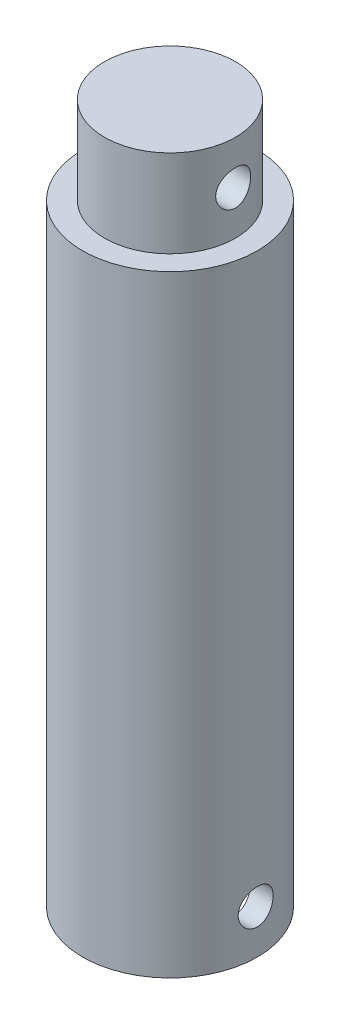
ISO-10303-21;
HEADER;
FILE_DESCRIPTION(('STEP AP214'),'2;1');
FILE_NAME('part.step','',(''),(''),'','','');
FILE_SCHEMA(('AUTOMOTIVE_DESIGN { 1 0 10303 214 1 1 1 1 }'));
ENDSEC;
DATA;
#1=APPLICATION_CONTEXT('core data for automotive mechanical design processes');
#2=APPLICATION_PROTOCOL_DEFINITION('international standard','automotive_design',2000,#1);
#3=PRODUCT_CONTEXT('',#1,'mechanical');
#4=PRODUCT('Part','Part','',(#3));
#5=PRODUCT_RELATED_PRODUCT_CATEGORY('part','',(#4));
#6=PRODUCT_DEFINITION_FORMATION('','',#4);
#7=PRODUCT_DEFINITION_CONTEXT('part definition',#1,'design');
#8=PRODUCT_DEFINITION('design','',#6,#7);
#9=PRODUCT_DEFINITION_SHAPE('','',#8);
#10=(LENGTH_UNIT() NAMED_UNIT(*) SI_UNIT(.MILLI.,.METRE.));
#11=(NAMED_UNIT(*) PLANE_ANGLE_UNIT() SI_UNIT($,.RADIAN.));
#12=(NAMED_UNIT(*) SI_UNIT($,.STERADIAN.) SOLID_ANGLE_UNIT());
#13=UNCERTAINTY_MEASURE_WITH_UNIT(LENGTH_MEASURE(1.E-05),#10,'distance_accuracy_value','');
#14=(GEOMETRIC_REPRESENTATION_CONTEXT(3) GLOBAL_UNCERTAINTY_ASSIGNED_CONTEXT((#13)) GLOBAL_UNIT_ASSIGNED_CONTEXT((#10,
#11,#12)) REPRESENTATION_CONTEXT('',''));
#15=CARTESIAN_POINT('',(0.,0.,0.));
#16=DIRECTION('',(0.,0.,1.));
#17=DIRECTION('',(1.,0.,0.));
#18=AXIS2_PLACEMENT_3D('',#15,#16,#17);
#19=CARTESIAN_POINT('',(-1.56472057533108E-13,54.9999999999999,0.));
#20=DIRECTION('',(0.,-1.,0.));
#21=DIRECTION('',(1.,0.,0.));
#22=AXIS2_PLACEMENT_3D('',#19,#20,#21);
#23=CYLINDRICAL_SURFACE('',#22,10.);
#24=CARTESIAN_POINT('',(-1.28022592527089E-13,45.,0.));
#25=DIRECTION('',(0.,1.,0.));
#26=DIRECTION('',(-1.,0.,0.));
#27=AXIS2_PLACEMENT_3D('',#24,#25,#26);
#28=CIRCLE('',#27,10.);
#29=CARTESIAN_POINT('',(-10.0000000000001,44.9999999999999,0.));
#30=VERTEX_POINT('',#29);
#31=EDGE_CURVE('E10',#30,#30,#28,.T.);
#32=ORIENTED_EDGE('',*,*,#31,.F.);
#33=EDGE_LOOP('',(#32));
#34=FACE_BOUND('',#33,.T.);
#35=CARTESIAN_POINT('',(0.,-25.0000000000001,0.));
#36=DIRECTION('',(0.,1.,0.));
#37=DIRECTION('',(-1.,0.,0.));
#38=AXIS2_PLACEMENT_3D('',#35,#36,#37);
#39=CIRCLE('',#38,10.);
#40=CARTESIAN_POINT('',(-9.99999999999993,-25.0000000000002,0.));
#41=VERTEX_POINT('',#40);
#42=EDGE_CURVE('E77',#41,#41,#39,.T.);
#43=ORIENTED_EDGE('',*,*,#42,.T.);
#44=EDGE_LOOP('',(#43));
#45=FACE_BOUND('',#44,.T.);
#46=CARTESIAN_POINT('',(-9.79795897113266,-20.0000000000001,2.));
#47=CARTESIAN_POINT('',(-9.79796118053287,-19.8888712490178,1.99999589175054));
#48=CARTESIAN_POINT('',(-9.79987016537398,-19.7776907533334,1.99070634343629));
#49=CARTESIAN_POINT('',(-9.80728862609744,-19.5584749897138,1.95382456716568));
#50=CARTESIAN_POINT('',(-9.81280098289569,-19.4504423107281,1.92621769414099));
#51=CARTESIAN_POINT('',(-9.82677747443703,-19.2407253932917,1.85359156523949));
#52=CARTESIAN_POINT('',(-9.83523867242145,-19.1390349569349,1.80858962830524));
#53=CARTESIAN_POINT('',(-9.85415598961312,-18.9446503106062,1.70249821534101));
#54=CARTESIAN_POINT('',(-9.86461199746917,-18.8519555989243,1.6414096372023));
#55=CARTESIAN_POINT('',(-9.886505993885,-18.6768779922924,1.50395815130687));
#56=CARTESIAN_POINT('',(-9.89795475674488,-18.5946408242321,1.42741131182664));
#57=CARTESIAN_POINT('',(-9.92044944605192,-18.4440849328421,1.26161357804262));
#58=CARTESIAN_POINT('',(-9.93149534421658,-18.3757671851657,1.17236179395597));
#59=CARTESIAN_POINT('',(-9.95205592835119,-18.2544239647432,0.982722711848509));
#60=CARTESIAN_POINT('',(-9.96155642883096,-18.2015369723668,0.882245135344419));
#61=CARTESIAN_POINT('',(-9.97783473767258,-18.1134501259038,0.67360830077454));
#62=CARTESIAN_POINT('',(-9.98461280088233,-18.0782486161981,0.565449762841103));
#63=CARTESIAN_POINT('',(-9.99460641376832,-18.0269856127608,0.346033546556986));
#64=CARTESIAN_POINT('',(-9.99786772576249,-18.0106780448581,0.234835478429626));
#65=CARTESIAN_POINT('',(-10.000618423672,-17.9968980963234,0.0112371368750714));
#66=CARTESIAN_POINT('',(-10.0001081730551,-17.9994239007084,-0.101163019663687));
#67=CARTESIAN_POINT('',(-9.99540869737026,-18.0230523604312,-0.322284001487177));
#68=CARTESIAN_POINT('',(-9.99127196731671,-18.0438899543358,-0.43103442859694));
#69=CARTESIAN_POINT('',(-9.97984354318812,-18.1031300649179,-0.643463253160602));
#70=CARTESIAN_POINT('',(-9.97255172288073,-18.1415332843838,-0.747141447494258));
#71=CARTESIAN_POINT('',(-9.95554592039912,-18.2350600802946,-0.947238926401775));
#72=CARTESIAN_POINT('',(-9.94581696350442,-18.2902875022099,-1.0436083482678));
#73=CARTESIAN_POINT('',(-9.92500938947565,-18.4158181544733,-1.22581009171951));
#74=CARTESIAN_POINT('',(-9.91393061710439,-18.4861231195411,-1.31164119905));
#75=CARTESIAN_POINT('',(-9.89141928728914,-18.641267244217,-1.47190286210691));
#76=CARTESIAN_POINT('',(-9.87998392915027,-18.7263383734593,-1.54610863314726));
#77=CARTESIAN_POINT('',(-9.85823143197516,-18.9078328849016,-1.67923698635361));
#78=CARTESIAN_POINT('',(-9.84791431409091,-19.0042564817665,-1.7381592794555));
#79=CARTESIAN_POINT('',(-9.82956094945842,-19.2060416636437,-1.83912562960376));
#80=CARTESIAN_POINT('',(-9.82152963127093,-19.3114219352794,-1.88113329555542));
#81=CARTESIAN_POINT('',(-9.8087295264254,-19.5279426474481,-1.94678068325516));
#82=CARTESIAN_POINT('',(-9.8039603145685,-19.6390823352382,-1.97042279891329));
#83=CARTESIAN_POINT('',(-9.7983095853565,-19.8619297159982,-1.9983320120721));
#84=CARTESIAN_POINT('',(-9.79736294114303,-19.9735951486208,-2.00292371779582));
#85=CARTESIAN_POINT('',(-9.79928971377702,-20.1960964463994,-1.99347525662148));
#86=CARTESIAN_POINT('',(-9.8021629140077,-20.3069323582378,-1.97943614624489));
#87=CARTESIAN_POINT('',(-9.81134464989823,-20.5235372805845,-1.93340441614831));
#88=CARTESIAN_POINT('',(-9.81761998028987,-20.6293446860716,-1.9015852416786));
#89=CARTESIAN_POINT('',(-9.83286978703324,-20.8341265580576,-1.82108207061704));
#90=CARTESIAN_POINT('',(-9.84184448572533,-20.9331004608715,-1.77239668474636));
#91=CARTESIAN_POINT('',(-9.86162811924073,-21.1228262199004,-1.6588082844312));
#92=CARTESIAN_POINT('',(-9.872459437298,-21.2134540926017,-1.59370215596551));
#93=CARTESIAN_POINT('',(-9.89467447653267,-21.3826166240019,-1.44939114442543));
#94=CARTESIAN_POINT('',(-9.9060582544763,-21.4611500364986,-1.37018481028908));
#95=CARTESIAN_POINT('',(-9.92830691738425,-21.6051251183712,-1.19846454699578));
#96=CARTESIAN_POINT('',(-9.93916115417361,-21.6703473093001,-1.10576499785926));
#97=CARTESIAN_POINT('',(-9.95894255257233,-21.7842917629992,-0.91053579326951));
#98=CARTESIAN_POINT('',(-9.96786979510416,-21.8330147186896,-0.808006550867013));
#99=CARTESIAN_POINT('',(-9.98274588122126,-21.9122577434934,-0.596605361648026));
#100=CARTESIAN_POINT('',(-9.98871158285199,-21.9428810364526,-0.487773346956157));
#101=CARTESIAN_POINT('',(-9.99706471875317,-21.9853824953278,-0.266378909359824));
#102=CARTESIAN_POINT('',(-9.99945258399692,-21.9972629189514,-0.153816937422424));
#103=CARTESIAN_POINT('',(-10.0003708090822,-22.0018539619259,0.0697457878072416));
#104=CARTESIAN_POINT('',(-9.99896757098653,-21.9948945609125,0.180739624282988));
#105=CARTESIAN_POINT('',(-9.99260087120672,-21.9627320989044,0.3999420626313));
#106=CARTESIAN_POINT('',(-9.98763745428856,-21.9375292673038,0.508150699507445));
#107=CARTESIAN_POINT('',(-9.97470996729835,-21.8697420158169,0.718505499490129));
#108=CARTESIAN_POINT('',(-9.96675274495224,-21.8271972437381,0.820664886480329));
#109=CARTESIAN_POINT('',(-9.94869444247354,-21.7259755173379,1.01644244037214));
#110=CARTESIAN_POINT('',(-9.9385931929397,-21.6672972881911,1.11005993153569));
#111=CARTESIAN_POINT('',(-9.91715198313474,-21.5343612258775,1.28772778021183));
#112=CARTESIAN_POINT('',(-9.90579466835795,-21.4598673272325,1.37159943222969));
#113=CARTESIAN_POINT('',(-9.88322445815724,-21.2978995198025,1.52576523551701));
#114=CARTESIAN_POINT('',(-9.87201159757432,-21.2104225410402,1.59605616641783));
#115=CARTESIAN_POINT('',(-9.85086685467857,-21.0238413666192,1.72178443889996));
#116=CARTESIAN_POINT('',(-9.84095007142446,-20.9246220777576,1.77705362923618));
#117=CARTESIAN_POINT('',(-9.8237047425282,-20.7181344534799,1.87004809853245));
#118=CARTESIAN_POINT('',(-9.81637385049962,-20.6108735226257,1.90778929194833));
#119=CARTESIAN_POINT('',(-9.80659362275684,-20.4194750891143,1.95733827971531));
#120=CARTESIAN_POINT('',(-9.80337569829206,-20.3364291609722,1.97330779704737));
#121=CARTESIAN_POINT('',(-9.79905756918163,-20.1689320908978,1.99464003591942));
#122=CARTESIAN_POINT('',(-9.7979572915283,-20.0844809975111,2.00000312312529));
#123=CARTESIAN_POINT('',(-9.79795897113266,-20.0000000000001,2.));
#124=B_SPLINE_CURVE_WITH_KNOTS('',3,(#46,#47,#48,#49,#50,#51,#52,#53,#54,#55,#56,#57,#58,#59,
#60,#61,#62,#63,#64,#65,#66,#67,#68,#69,#70,#71,#72,#73,#74,#75,#76,#77,#78,#79,#80,#81,#82,#83,
#84,#85,#86,#87,#88,#89,#90,#91,#92,#93,#94,#95,#96,#97,#98,#99,#100,#101,#102,#103,#104,#105,
#106,#107,#108,#109,#110,#111,#112,#113,#114,#115,#116,#117,#118,#119,#120,#121,#122,#123),
.UNSPECIFIED.,.T.,.F.,(4,2,2,2,2,2,2,2,2,2,2,2,2,2,2,2,2,2,2,2,2,2,2,2,2,2,2,2,2,2,2,2,2,2,2,2,
2,2,4),(0.,0.333076927738858,0.666420478568594,0.999432995881173,1.33242692971973,
1.66964505096873,2.00688680070844,2.34706800874901,2.6872173649312,3.02288497766161,
3.35852024232497,3.68937579267075,4.020244581475,4.35319848444606,4.68619071540132,
5.02498693524967,5.3637895624544,5.70331726345553,6.0428007003205,6.37647515609187,
6.71013069056843,7.04058683566638,7.37107020708797,7.70586119549042,8.04068665740418,
8.38065203466902,8.7206031326021,9.05859627157301,9.39654869383256,9.72862034829372,
10.0606878273351,10.392000341509,10.7233390426937,11.0600230405119,11.3967867777956,
11.7371779715921,12.077259501804,12.3304760727632,12.5836839137096),.UNSPECIFIED.);
#125=CARTESIAN_POINT('',(-9.79795897113266,-20.0000000000001,2.));
#126=VERTEX_POINT('',#125);
#127=EDGE_CURVE('E113',#126,#126,#124,.T.);
#128=ORIENTED_EDGE('',*,*,#127,.F.);
#129=EDGE_LOOP('',(#128));
#130=FACE_BOUND('',#129,.T.);
#131=CARTESIAN_POINT('',(10.0000000000001,-18.0000000000001,0.));
#132=CARTESIAN_POINT('',(9.99999795161747,-18.0000040889968,0.111153813585266));
#133=CARTESIAN_POINT('',(9.99812770356467,-18.0092976859354,0.222359320403044));
#134=CARTESIAN_POINT('',(9.99084731246468,-18.0461970002306,0.441627015378038));
#135=CARTESIAN_POINT('',(9.98543435720378,-18.0738172656031,0.549686635082712));
#136=CARTESIAN_POINT('',(9.97167298556579,-18.1464825472417,0.759460610526627));
#137=CARTESIAN_POINT('',(9.96332738153441,-18.1915108736895,0.861180935866269));
#138=CARTESIAN_POINT('',(9.94460796070634,-18.2976644950227,1.05561597772845));
#139=CARTESIAN_POINT('',(9.93423426471419,-18.3587888312145,1.14833123015162));
#140=CARTESIAN_POINT('',(9.91244330659945,-18.4962769885829,1.32338695462973));
#141=CARTESIAN_POINT('',(9.901014910087,-18.5728167107825,1.40558790231705));
#142=CARTESIAN_POINT('',(9.87848360905182,-18.7385848327835,1.55607351321606));
#143=CARTESIAN_POINT('',(9.86738073000853,-18.8278142226703,1.62435708954085));
#144=CARTESIAN_POINT('',(9.84664883625236,-19.0174323860238,1.74566350669524));
#145=CARTESIAN_POINT('',(9.83703414729897,-19.1179152875928,1.79854187773173));
#146=CARTESIAN_POINT('',(9.82052536116841,-19.3265636380082,1.88661133316062));
#147=CARTESIAN_POINT('',(9.81363099523929,-19.4347283266928,1.92180416487448));
#148=CARTESIAN_POINT('',(9.80345610504415,-19.6541687278159,1.97305059976965));
#149=CARTESIAN_POINT('',(9.80012940214381,-19.7653850882845,1.98934899591755));
#150=CARTESIAN_POINT('',(9.7973275012126,-19.9890196427288,2.00310425545224));
#151=CARTESIAN_POINT('',(9.79785190935687,-20.1014377126404,2.000563045427));
#152=CARTESIAN_POINT('',(9.80265102296375,-20.3224935760421,1.97690914620364));
#153=CARTESIAN_POINT('',(9.80686905717533,-20.4311628112547,1.95607708048781));
#154=CARTESIAN_POINT('',(9.81849092320008,-20.6434321533261,1.8968757692461));
#155=CARTESIAN_POINT('',(9.82589490715563,-20.7470320178381,1.85850568620136));
#156=CARTESIAN_POINT('',(9.84311237000822,-20.9470305234073,1.76504956734944));
#157=CARTESIAN_POINT('',(9.85294179627415,-21.0433757591384,1.70985230246423));
#158=CARTESIAN_POINT('',(9.8738923754613,-21.2255416999457,1.58438714914536));
#159=CARTESIAN_POINT('',(9.88501367676738,-21.3113611937024,1.51411752871366));
#160=CARTESIAN_POINT('',(9.9075404248293,-21.471658804914,1.35899986912117));
#161=CARTESIAN_POINT('',(9.91894738421816,-21.5459051357183,1.27391232242489));
#162=CARTESIAN_POINT('',(9.94057697428823,-21.6791076926025,1.09237004812402));
#163=CARTESIAN_POINT('',(9.95079958977953,-21.7380637225872,0.995915174758779));
#164=CARTESIAN_POINT('',(9.9689338032178,-21.839055018452,0.794118773757842));
#165=CARTESIAN_POINT('',(9.9768417769655,-21.8810637872892,0.688763639170601));
#166=CARTESIAN_POINT('',(9.98942817975723,-21.9467209480772,0.47229795289733));
#167=CARTESIAN_POINT('',(9.99410700001069,-21.9703715641473,0.3611881001449));
#168=CARTESIAN_POINT('',(9.99965343733742,-21.9983129075886,0.138358811254301));
#169=CARTESIAN_POINT('',(10.0005834930495,-22.0029208390806,0.0266806566511523));
#170=CARTESIAN_POINT('',(9.99870103860212,-21.9935002821157,-0.195849868385429));
#171=CARTESIAN_POINT('',(9.99588873882899,-21.9794728412949,-0.306702284887587));
#172=CARTESIAN_POINT('',(9.98687664016041,-21.9334432529122,-0.523411319893083));
#173=CARTESIAN_POINT('',(9.98070752808419,-21.9016038630043,-0.629303896679809));
#174=CARTESIAN_POINT('',(9.96567104122071,-21.8210320346885,-0.834247254999337));
#175=CARTESIAN_POINT('',(9.9568034642846,-21.7722983306464,-0.933297523275081));
#176=CARTESIAN_POINT('',(9.93719823066595,-21.6586350186975,-1.12308234737244));
#177=CARTESIAN_POINT('',(9.9264390087411,-21.5935144379222,-1.21370025350438));
#178=CARTESIAN_POINT('',(9.90429469659771,-21.4491816175855,-1.38283603823841));
#179=CARTESIAN_POINT('',(9.89290953936782,-21.3699678672003,-1.46135261786153));
#180=CARTESIAN_POINT('',(9.87058607113936,-21.1982532962178,-1.60528118154835));
#181=CARTESIAN_POINT('',(9.85965720466615,-21.1055685115574,-1.67047540489731));
#182=CARTESIAN_POINT('',(9.83968383592394,-20.9103772772867,-1.78437084010241));
#183=CARTESIAN_POINT('',(9.83063925826691,-20.807871220853,-1.83307271184581));
#184=CARTESIAN_POINT('',(9.81553481168771,-20.596463507701,-1.91230368316392));
#185=CARTESIAN_POINT('',(9.80945949744379,-20.4875983175794,-1.9429269995821));
#186=CARTESIAN_POINT('',(9.80094873584056,-20.2661330930183,-1.98541730325439));
#187=CARTESIAN_POINT('',(9.79851281382229,-20.1535335475814,-1.99728673645023));
#188=CARTESIAN_POINT('',(9.79758299262764,-19.9299822709114,-2.00184182173494));
#189=CARTESIAN_POINT('',(9.79901838378607,-19.8190377021461,-1.99487157614179));
#190=CARTESIAN_POINT('',(9.80551146969233,-19.59993670019,-1.96270460820012));
#191=CARTESIAN_POINT('',(9.81056913534344,-19.4917802446105,-1.9375080322586));
#192=CARTESIAN_POINT('',(9.82370528438322,-19.281544577519,-1.86975713699791));
#193=CARTESIAN_POINT('',(9.83177642037666,-19.1794512789952,-1.82724501343469));
#194=CARTESIAN_POINT('',(9.85003429948346,-18.9837925585312,-1.72610928920321));
#195=CARTESIAN_POINT('',(9.86022121997793,-18.8902278525498,-1.66748433754976));
#196=CARTESIAN_POINT('',(9.88177921046456,-18.7125688556995,-1.53461182957283));
#197=CARTESIAN_POINT('',(9.89316745819405,-18.6286624694649,-1.46011577447036));
#198=CARTESIAN_POINT('',(9.91572163743915,-18.4744275889417,-1.29812873802628));
#199=CARTESIAN_POINT('',(9.92688751726374,-18.4041022193655,-1.21063477430667));
#200=CARTESIAN_POINT('',(9.94787664775948,-18.2783307121072,-1.02403525817649));
#201=CARTESIAN_POINT('',(9.95768462438498,-18.22304799344,-0.924817768859667));
#202=CARTESIAN_POINT('',(9.97470250170005,-18.1300277548069,-0.718332721881464));
#203=CARTESIAN_POINT('',(9.98191474277237,-18.0922744209351,-0.611072521726252));
#204=CARTESIAN_POINT('',(9.99152745190746,-18.0426961039106,-0.41964297784756));
#205=CARTESIAN_POINT('',(9.99468606316909,-18.0267136125846,-0.33656332802757));
#206=CARTESIAN_POINT('',(9.99892308279791,-18.0053641752834,-0.168999050420134));
#207=CARTESIAN_POINT('',(10.0000015574632,-17.9999968909805,-0.0845144674972381));
#208=CARTESIAN_POINT('',(10.0000000000001,-18.0000000000001,0.));
#209=B_SPLINE_CURVE_WITH_KNOTS('',3,(#131,#132,#133,#134,#135,#136,#137,#138,#139,#140,#141,
#142,#143,#144,#145,#146,#147,#148,#149,#150,#151,#152,#153,#154,#155,#156,#157,#158,#159,#160,
#161,#162,#163,#164,#165,#166,#167,#168,#169,#170,#171,#172,#173,#174,#175,#176,#177,#178,#179,
#180,#181,#182,#183,#184,#185,#186,#187,#188,#189,#190,#191,#192,#193,#194,#195,#196,#197,#198,
#199,#200,#201,#202,#203,#204,#205,#206,#207,#208),.UNSPECIFIED.,.T.,.F.,(4,2,2,2,2,2,2,2,2,2,2,
2,2,2,2,2,2,2,2,2,2,2,2,2,2,2,2,2,2,2,2,2,2,2,2,2,2,2,4),(0.,0.333152261322517,
0.666569301382647,0.999667470500685,1.33274580446173,1.66986534022437,2.00701119349473,
2.34722390011846,2.68740298730395,3.02312370207175,3.35881008562451,3.68943454012557,
4.02007478507459,4.35294980407185,4.68586309499341,5.02476504982701,5.3636713507964,
5.70310549708048,6.04249851396072,6.3762147135253,6.70991215315735,7.04060907901447,
7.37133078432045,7.70610132066717,8.0409077669186,8.38081257158451,8.72070377446933,
9.05880762065446,9.3968673666083,9.72879445135403,10.0607188698522,10.3918392250622,
10.7229873516373,11.0597615247829,11.3966130906586,11.7369899335127,12.0770591103504,
12.3303755057979,12.5836838274199),.UNSPECIFIED.);
#210=CARTESIAN_POINT('',(10.0000000000001,-18.0000000000001,0.));
#211=VERTEX_POINT('',#210);
#212=EDGE_CURVE('E119',#211,#211,#209,.T.);
#213=ORIENTED_EDGE('',*,*,#212,.F.);
#214=EDGE_LOOP('',(#213));
#215=FACE_BOUND('',#214,.T.);
#216=ADVANCED_FACE('F43',(#34,#45,#130,#215),#23,.T.);
#217=CARTESIAN_POINT('',(0.,-15.0000000000001,0.));
#218=DIRECTION('',(0.,-1.,0.));
#219=DIRECTION('',(1.,0.,0.));
#220=AXIS2_PLACEMENT_3D('',#217,#218,#219);
#221=CYLINDRICAL_SURFACE('',#220,7.5);
#222=CARTESIAN_POINT('',(0.,-15.0000000000001,0.));
#223=DIRECTION('',(0.,-1.,0.));
#224=DIRECTION('',(1.,0.,0.));
#225=AXIS2_PLACEMENT_3D('',#222,#223,#224);
#226=CIRCLE('',#225,7.5);
#227=CARTESIAN_POINT('',(7.50000000000004,-15.0000000000001,0.));
#228=VERTEX_POINT('',#227);
#229=EDGE_CURVE('E151',#228,#228,#226,.T.);
#230=ORIENTED_EDGE('',*,*,#229,.F.);
#231=EDGE_LOOP('',(#230));
#232=FACE_BOUND('',#231,.T.);
#233=CARTESIAN_POINT('',(0.,-25.0000000000001,0.));
#234=DIRECTION('',(0.,-1.,0.));
#235=DIRECTION('',(1.,0.,0.));
#236=AXIS2_PLACEMENT_3D('',#233,#234,#235);
#237=CIRCLE('',#236,7.5);
#238=CARTESIAN_POINT('',(7.50000000000007,-25.,0.));
#239=VERTEX_POINT('',#238);
#240=EDGE_CURVE('E155',#239,#239,#237,.T.);
#241=ORIENTED_EDGE('',*,*,#240,.T.);
#242=EDGE_LOOP('',(#241));
#243=FACE_BOUND('',#242,.T.);
#244=CARTESIAN_POINT('',(-7.22841614740042,-20.0000000000001,2.));
#245=CARTESIAN_POINT('',(-7.22841805697246,-20.1101759377404,1.99999734315871));
#246=CARTESIAN_POINT('',(-7.23096264549667,-20.2203800004761,1.99086493224743));
#247=CARTESIAN_POINT('',(-7.24083561155091,-20.4376054215565,1.95464583260237));
#248=CARTESIAN_POINT('',(-7.24816638907928,-20.5446251549781,1.92755013620953));
#249=CARTESIAN_POINT('',(-7.26672375176833,-20.7523080699469,1.85635845560074));
#250=CARTESIAN_POINT('',(-7.27794485684198,-20.8529799588285,1.81228637542178));
#251=CARTESIAN_POINT('',(-7.30301154920395,-21.0455167400599,1.70846784563704));
#252=CARTESIAN_POINT('',(-7.31685734034418,-21.1373809475071,1.6487201784145));
#253=CARTESIAN_POINT('',(-7.34600139553461,-21.3119925469878,1.5136484787456));
#254=CARTESIAN_POINT('',(-7.36132541116437,-21.3944870174645,1.43800297504208));
#255=CARTESIAN_POINT('',(-7.39147701436501,-21.5457815769513,1.27397427284021));
#256=CARTESIAN_POINT('',(-7.40630455033433,-21.6145802461419,1.18558975534665));
#257=CARTESIAN_POINT('',(-7.43407988468412,-21.737584938403,0.996838170873272));
#258=CARTESIAN_POINT('',(-7.44699376262287,-21.7915395186329,0.896301819879482));
#259=CARTESIAN_POINT('',(-7.46919126211828,-21.8816846353673,0.687183044729093));
#260=CARTESIAN_POINT('',(-7.47847549576256,-21.9178781672816,0.578601980875106));
#261=CARTESIAN_POINT('',(-7.49218553576455,-21.9706552202358,0.359115961810092));
#262=CARTESIAN_POINT('',(-7.49671776750258,-21.987668976626,0.248321224200918));
#263=CARTESIAN_POINT('',(-7.50078524617743,-22.0029571201073,0.0253635535085773));
#264=CARTESIAN_POINT('',(-7.50032132946602,-22.0012346436302,-0.0867991474385284));
#265=CARTESIAN_POINT('',(-7.49452675859759,-21.9794021874606,-0.306314237111345));
#266=CARTESIAN_POINT('',(-7.48931914026993,-21.9597570423638,-0.413716600721109));
#267=CARTESIAN_POINT('',(-7.47476748590464,-21.9033878622181,-0.623641315571054));
#268=CARTESIAN_POINT('',(-7.46542321400583,-21.866662853314,-0.726163388180579));
#269=CARTESIAN_POINT('',(-7.44346569099886,-21.7768201524077,-0.924603945147553));
#270=CARTESIAN_POINT('',(-7.43082087877666,-21.7235431928994,-1.02044668632954));
#271=CARTESIAN_POINT('',(-7.40362468509498,-21.602231180491,-1.20198999876451));
#272=CARTESIAN_POINT('',(-7.38907293222994,-21.5341932509719,-1.28768858808586));
#273=CARTESIAN_POINT('',(-7.35911272938713,-21.3828231420662,-1.44928536946561));
#274=CARTESIAN_POINT('',(-7.34369169368732,-21.2990855549507,-1.52480192017773));
#275=CARTESIAN_POINT('',(-7.31413405023515,-21.1199753237613,-1.6608133210477));
#276=CARTESIAN_POINT('',(-7.29999752083059,-21.0246019707996,-1.72130725529808));
#277=CARTESIAN_POINT('',(-7.27455902280771,-20.8240998981788,-1.82584679186274));
#278=CARTESIAN_POINT('',(-7.2632750709215,-20.7189146490869,-1.86978866600526));
#279=CARTESIAN_POINT('',(-7.24504325087509,-20.5022735005451,-1.93924001685674));
#280=CARTESIAN_POINT('',(-7.23809430746839,-20.3908191635498,-1.96475406461341));
#281=CARTESIAN_POINT('',(-7.2295483561297,-20.1683727889717,-1.99596757092855));
#282=CARTESIAN_POINT('',(-7.22779763213451,-20.0574664513788,-2.00223632621177));
#283=CARTESIAN_POINT('',(-7.22942578390809,-19.8361902271915,-1.9963498112297));
#284=CARTESIAN_POINT('',(-7.23280411376433,-19.7258202847601,-1.98419650172323));
#285=CARTESIAN_POINT('',(-7.24416124318859,-19.5109434059085,-1.94231271869971));
#286=CARTESIAN_POINT('',(-7.25205039699294,-19.4063645620629,-1.91292447912922));
#287=CARTESIAN_POINT('',(-7.27145268952779,-19.2036203686401,-1.83778986725474));
#288=CARTESIAN_POINT('',(-7.28296630148558,-19.1054558585727,-1.79204135876651));
#289=CARTESIAN_POINT('',(-7.30863572472979,-18.9159450425649,-1.68432905508707));
#290=CARTESIAN_POINT('',(-7.32284404872859,-18.8247960241103,-1.62203095237924));
#291=CARTESIAN_POINT('',(-7.35217841933661,-18.6540366982969,-1.48340227987515));
#292=CARTESIAN_POINT('',(-7.36730463810233,-18.5744285650459,-1.40706907222967));
#293=CARTESIAN_POINT('',(-7.3972996488445,-18.4266475267502,-1.23990378250484));
#294=CARTESIAN_POINT('',(-7.41214836523843,-18.3588716230215,-1.14871641600885));
#295=CARTESIAN_POINT('',(-7.43946670017122,-18.2395890125896,-0.955928435940746));
#296=CARTESIAN_POINT('',(-7.45193644532899,-18.1880814399212,-0.854328377018887));
#297=CARTESIAN_POINT('',(-7.47301150899255,-18.1032703676386,-0.644314134825875));
#298=CARTESIAN_POINT('',(-7.4816455848038,-18.0698309805566,-0.53595785288234));
#299=CARTESIAN_POINT('',(-7.49420303787242,-18.0217112719357,-0.314899384731322));
#300=CARTESIAN_POINT('',(-7.49812745904975,-18.0070267932254,-0.202198167320246));
#301=CARTESIAN_POINT('',(-7.50077413437686,-17.9970941762586,0.0206420013461469));
#302=CARTESIAN_POINT('',(-7.49965226288077,-18.0012636808689,0.130753511527862));
#303=CARTESIAN_POINT('',(-7.49268490978855,-18.0275684935753,0.348648304630715));
#304=CARTESIAN_POINT('',(-7.4868396055478,-18.0497031271171,0.456431674812812));
#305=CARTESIAN_POINT('',(-7.47111310390918,-18.1109806049187,0.665910123464208));
#306=CARTESIAN_POINT('',(-7.46125997189224,-18.1500052934725,0.767642011851537));
#307=CARTESIAN_POINT('',(-7.43854816516489,-18.2438496017463,0.963172098471351));
#308=CARTESIAN_POINT('',(-7.42568906899248,-18.2986714366129,1.05696918166215));
#309=CARTESIAN_POINT('',(-7.39791331224116,-18.4242582721371,1.23667826867367));
#310=CARTESIAN_POINT('',(-7.3829509337163,-18.4954093806987,1.32231336173331));
#311=CARTESIAN_POINT('',(-7.35284000077251,-18.650902749365,1.48062537156133));
#312=CARTESIAN_POINT('',(-7.33769139839716,-18.7352484758194,1.55329887243048));
#313=CARTESIAN_POINT('',(-7.3085395963885,-18.9169683958177,1.68520700232561));
#314=CARTESIAN_POINT('',(-7.29456891224641,-19.0145883136573,1.74411094261233));
#315=CARTESIAN_POINT('',(-7.26981393903467,-19.2187063108603,1.84458689030054));
#316=CARTESIAN_POINT('',(-7.25902756724941,-19.3251985285396,1.88617023367332));
#317=CARTESIAN_POINT('',(-7.24336000653869,-19.5260813360513,1.94538124252481));
#318=CARTESIAN_POINT('',(-7.23780140272189,-19.6196012645568,1.96581518399489));
#319=CARTESIAN_POINT('',(-7.23032885211565,-19.8087405579941,1.9931249429388));
#320=CARTESIAN_POINT('',(-7.22841448976011,-19.9043596822889,2.0000023063216));
#321=CARTESIAN_POINT('',(-7.22841614740042,-20.0000000000001,2.));
#322=B_SPLINE_CURVE_WITH_KNOTS('',3,(#244,#245,#246,#247,#248,#249,#250,#251,#252,#253,#254,
#255,#256,#257,#258,#259,#260,#261,#262,#263,#264,#265,#266,#267,#268,#269,#270,#271,#272,#273,
#274,#275,#276,#277,#278,#279,#280,#281,#282,#283,#284,#285,#286,#287,#288,#289,#290,#291,#292,
#293,#294,#295,#296,#297,#298,#299,#300,#301,#302,#303,#304,#305,#306,#307,#308,#309,#310,#311,
#312,#313,#314,#315,#316,#317,#318,#319,#320,#321),.UNSPECIFIED.,.T.,.F.,(4,2,2,2,2,2,2,2,2,2,2,
2,2,2,2,2,2,2,2,2,2,2,2,2,2,2,2,2,2,2,2,2,2,2,2,2,2,2,4),(0.,0.330176128116026,0.6605179478502,
0.990396311596164,1.32030030656105,1.65765916130211,1.99505297124461,2.33785207370803,
2.68059334304246,3.0154830431648,3.35031668385603,3.67670570800803,4.00311334440695,
4.3327644890557,4.66247993394491,5.00231762300329,5.34217602639579,5.68413015096536,
6.02599942418507,6.35765334242023,6.68927196343503,7.01451850432574,7.33980752864823,
7.67224634967772,8.00474771541474,8.34685906959632,8.68895221008103,9.028435395914,
9.36784331959005,9.69684054916463,10.0258254261296,10.3525451486866,10.6793107076596,
11.0147885399158,11.3503546538105,11.6933003898558,12.0360213210131,12.3226696767153,
12.6092853429065),.UNSPECIFIED.);
#323=CARTESIAN_POINT('',(-7.22841614740042,-20.0000000000001,2.));
#324=VERTEX_POINT('',#323);
#325=EDGE_CURVE('E97',#324,#324,#322,.T.);
#326=ORIENTED_EDGE('',*,*,#325,.F.);
#327=EDGE_LOOP('',(#326));
#328=FACE_BOUND('',#327,.T.);
#329=CARTESIAN_POINT('',(7.50000000000005,-18.0000000000001,0.));
#330=CARTESIAN_POINT('',(7.49999833810167,-18.0000026169349,-0.110254555832854));
#331=CARTESIAN_POINT('',(7.49754486162156,-18.0091476141898,-0.220537160221841));
#332=CARTESIAN_POINT('',(7.48799573621665,-18.0454212307388,-0.437925451354464));
#333=CARTESIAN_POINT('',(7.48089785332591,-18.0725585044262,-0.545029583319087));
#334=CARTESIAN_POINT('',(7.46284333252795,-18.1438716668641,-0.752891589045314));
#335=CARTESIAN_POINT('',(7.4518916713038,-18.1880255876661,-0.853657451015287));
#336=CARTESIAN_POINT('',(7.42728699151683,-18.2920372426667,-1.04635368639266));
#337=CARTESIAN_POINT('',(7.41363379295185,-18.3518960233594,-1.13828347044963));
#338=CARTESIAN_POINT('',(7.38474614902,-18.4870835164135,-1.31282950374002));
#339=CARTESIAN_POINT('',(7.36948467678687,-18.5627086680083,-1.39521168986279));
#340=CARTESIAN_POINT('',(7.33927409679597,-18.7266484830634,-1.54628713660638));
#341=CARTESIAN_POINT('',(7.32432502947248,-18.8149647776176,-1.61497863495665));
#342=CARTESIAN_POINT('',(7.29615537464377,-19.0036482348255,-1.73786409243415));
#343=CARTESIAN_POINT('',(7.28296888563244,-19.1041963282618,-1.79178877736488));
#344=CARTESIAN_POINT('',(7.26021477318193,-19.3133401110925,-1.88187548076994));
#345=CARTESIAN_POINT('',(7.2506464825327,-19.4219343123315,-1.91804077451369));
#346=CARTESIAN_POINT('',(7.23649115802405,-19.6414955378251,-1.97076920226504));
#347=CARTESIAN_POINT('',(7.23179647811495,-19.7523535399308,-1.98775670244692));
#348=CARTESIAN_POINT('',(7.22759830916376,-19.9754376833066,-2.0029703470582));
#349=CARTESIAN_POINT('',(7.22809385014451,-20.0876635650242,-2.00119999705754));
#350=CARTESIAN_POINT('',(7.23412378802036,-20.3069854153741,-1.97928510002699));
#351=CARTESIAN_POINT('',(7.23951735511537,-20.4141371820386,-1.95965406064765));
#352=CARTESIAN_POINT('',(7.25451013080694,-20.6235683344563,-1.90339748722183));
#353=CARTESIAN_POINT('',(7.26410967552618,-20.7258473300754,-1.86677059492995));
#354=CARTESIAN_POINT('',(7.28655661748392,-20.9239681438087,-1.77714356965256));
#355=CARTESIAN_POINT('',(7.29943942818709,-21.0197243392863,-1.72396341137784));
#356=CARTESIAN_POINT('',(7.32698229642451,-21.2011341588516,-1.60286503823778));
#357=CARTESIAN_POINT('',(7.34164270355192,-21.2867857891565,-1.53494392224251));
#358=CARTESIAN_POINT('',(7.3716751062987,-21.4484889974549,-1.38366607263419));
#359=CARTESIAN_POINT('',(7.38705471488837,-21.524136318315,-1.29987812728299));
#360=CARTESIAN_POINT('',(7.41636381276322,-21.6603887803504,-1.12061766820637));
#361=CARTESIAN_POINT('',(7.43029324488561,-21.7209933287025,-1.02514469420509));
#362=CARTESIAN_POINT('',(7.455218203983,-21.8256179028247,-0.82459825549745));
#363=CARTESIAN_POINT('',(7.46620072833566,-21.8695647704487,-0.719484902551786));
#364=CARTESIAN_POINT('',(7.48390044401006,-21.9390471888135,-0.503002294390392));
#365=CARTESIAN_POINT('',(7.49061856733755,-21.964586762724,-0.39163441192832));
#366=CARTESIAN_POINT('',(7.4988915855839,-21.9958948769179,-0.169254083145513));
#367=CARTESIAN_POINT('',(7.50058997470965,-22.002213039851,-0.0583242376413779));
#368=CARTESIAN_POINT('',(7.49904471691701,-21.9964168357531,0.1630100459012));
#369=CARTESIAN_POINT('',(7.49580158080359,-21.9843043738943,0.273414537062115));
#370=CARTESIAN_POINT('',(7.48483035496027,-21.9424415525401,0.488602449901781));
#371=CARTESIAN_POINT('',(7.47718026546336,-21.9129977538023,0.593449852027784));
#372=CARTESIAN_POINT('',(7.45826294894145,-21.8376640554921,0.796706971176067));
#373=CARTESIAN_POINT('',(7.44699532996168,-21.7917723737495,0.895115989216028));
#374=CARTESIAN_POINT('',(7.42175660559535,-21.6838261128195,1.08483847466795));
#375=CARTESIAN_POINT('',(7.40773686604963,-21.6214725332023,1.17597518846118));
#376=CARTESIAN_POINT('',(7.3786145236557,-21.4827483698421,1.34668463539715));
#377=CARTESIAN_POINT('',(7.36351170727526,-21.406375017399,1.42625507879918));
#378=CARTESIAN_POINT('',(7.3333974586671,-21.2392144225055,1.57388924478774));
#379=CARTESIAN_POINT('',(7.31840061429318,-21.1480814386049,1.64156519249816));
#380=CARTESIAN_POINT('',(7.29066447182733,-20.9554353039005,1.76067191185118));
#381=CARTESIAN_POINT('',(7.27792507956322,-20.8539225863778,1.81210336122161));
#382=CARTESIAN_POINT('',(7.25629268373216,-20.643904692924,1.89687411586112));
#383=CARTESIAN_POINT('',(7.24737748318015,-20.5354441881825,1.93031812253958));
#384=CARTESIAN_POINT('',(7.23439825126806,-20.3141606803253,1.97841205118791));
#385=CARTESIAN_POINT('',(7.2303329802002,-20.2013387996522,1.99306677602478));
#386=CARTESIAN_POINT('',(7.22761744573594,-19.9785052121163,2.00288989653714));
#387=CARTESIAN_POINT('',(7.22879397743244,-19.8685226797418,1.99868155618109));
#388=CARTESIAN_POINT('',(7.23602396081093,-19.6508964859901,1.97234376000439));
#389=CARTESIAN_POINT('',(7.24207728699444,-19.5432527644995,1.95021476535025));
#390=CARTESIAN_POINT('',(7.25827571073164,-19.3341442478702,1.88902515699699));
#391=CARTESIAN_POINT('',(7.2683888501965,-19.2326381572679,1.8500966107558));
#392=CARTESIAN_POINT('',(7.29156818136183,-19.0375211694659,1.75651554562386));
#393=CARTESIAN_POINT('',(7.30463483621369,-18.9439115136996,1.70186056024617));
#394=CARTESIAN_POINT('',(7.33272921440466,-18.7642696405035,1.57648909268817));
#395=CARTESIAN_POINT('',(7.34780333101696,-18.6785414650239,1.50534729767909));
#396=CARTESIAN_POINT('',(7.37795503783013,-18.5200375483328,1.349830535111));
#397=CARTESIAN_POINT('',(7.39303262798446,-18.4472649613312,1.26545235435874));
#398=CARTESIAN_POINT('',(7.42187812403974,-18.3152077623532,1.08367998108868));
#399=CARTESIAN_POINT('',(7.43561111314556,-18.2562449893508,0.986045961751778));
#400=CARTESIAN_POINT('',(7.45983810102903,-18.1556625840707,0.781888640416888));
#401=CARTESIAN_POINT('',(7.47033417683599,-18.1140318243365,0.675371094696296));
#402=CARTESIAN_POINT('',(7.48554752513473,-18.0547247145846,0.47437470488099));
#403=CARTESIAN_POINT('',(7.49092770592607,-18.0342506164076,0.380762016565035));
#404=CARTESIAN_POINT('',(7.49815449036461,-18.006887793833,0.191439795317076));
#405=CARTESIAN_POINT('',(7.50000144297275,-17.9999977278001,0.09573047040486));
#406=CARTESIAN_POINT('',(7.50000000000005,-18.0000000000001,0.));
#407=B_SPLINE_CURVE_WITH_KNOTS('',3,(#329,#330,#331,#332,#333,#334,#335,#336,#337,#338,#339,
#340,#341,#342,#343,#344,#345,#346,#347,#348,#349,#350,#351,#352,#353,#354,#355,#356,#357,#358,
#359,#360,#361,#362,#363,#364,#365,#366,#367,#368,#369,#370,#371,#372,#373,#374,#375,#376,#377,
#378,#379,#380,#381,#382,#383,#384,#385,#386,#387,#388,#389,#390,#391,#392,#393,#394,#395,#396,
#397,#398,#399,#400,#401,#402,#403,#404,#405,#406),.UNSPECIFIED.,.T.,.F.,(4,2,2,2,2,2,2,2,2,2,2,
2,2,2,2,2,2,2,2,2,2,2,2,2,2,2,2,2,2,2,2,2,2,2,2,2,2,2,4),(0.,0.330412598949569,
0.660984243761451,0.991130552971936,1.32129886708676,1.65834897954967,1.99544244925149,
2.33832582523229,2.681145941297,3.01622158250468,3.3512346040432,3.67691002045997,
4.0026114681294,4.33198673346498,4.6614268811763,5.00161259812322,5.34181171937598,
5.68348809603042,6.02508977190139,6.35682717524547,6.68853028925351,7.01453535642116,
7.34057575775615,7.6730028600455,8.00549568258887,8.34736496382789,8.68921998024107,
9.02906297699387,9.36881908663983,9.69743342403612,10.0260393052059,10.352107654483,
10.67822717123,11.0139433957139,11.3497412433245,11.692722522809,12.0354832614518,
12.3223981899334,12.6092847796638),.UNSPECIFIED.);
#408=CARTESIAN_POINT('',(7.50000000000005,-18.0000000000001,0.));
#409=VERTEX_POINT('',#408);
#410=EDGE_CURVE('E47',#409,#409,#407,.T.);
#411=ORIENTED_EDGE('',*,*,#410,.F.);
#412=EDGE_LOOP('',(#411));
#413=FACE_BOUND('',#412,.T.);
#414=ADVANCED_FACE('F89',(#232,#243,#328,#413),#221,.F.);
#415=CARTESIAN_POINT('',(-1.28022592527089E-13,45.,0.));
#416=DIRECTION('',(0.,1.,0.));
#417=DIRECTION('',(-1.,0.,0.));
#418=AXIS2_PLACEMENT_3D('',#415,#416,#417);
#419=CYLINDRICAL_SURFACE('',#418,7.5);
#420=CARTESIAN_POINT('',(7.22841614740034,50.,2.));
#421=CARTESIAN_POINT('',(7.22841805697237,50.1101759377402,1.99999734315871));
#422=CARTESIAN_POINT('',(7.23096264549659,50.220380000476,1.99086493224743));
#423=CARTESIAN_POINT('',(7.24083561155082,50.4376054215563,1.95464583260237));
#424=CARTESIAN_POINT('',(7.24816638907919,50.544625154978,1.92755013620952));
#425=CARTESIAN_POINT('',(7.26672375176824,50.7523080699467,1.85635845560073));
#426=CARTESIAN_POINT('',(7.27794485684189,50.8529799588284,1.81228637542178));
#427=CARTESIAN_POINT('',(7.30301154920387,51.0455167400598,1.70846784563704));
#428=CARTESIAN_POINT('',(7.31685734034409,51.1373809475069,1.6487201784145));
#429=CARTESIAN_POINT('',(7.34600139553452,51.3119925469877,1.51364847874559));
#430=CARTESIAN_POINT('',(7.36132541116428,51.3944870174644,1.43800297504208));
#431=CARTESIAN_POINT('',(7.39147701436492,51.5457815769511,1.27397427284021));
#432=CARTESIAN_POINT('',(7.40630455033424,51.6145802461417,1.18558975534664));
#433=CARTESIAN_POINT('',(7.43407988468404,51.7375849384029,0.996838170873268));
#434=CARTESIAN_POINT('',(7.44699376262278,51.7915395186328,0.896301819879479));
#435=CARTESIAN_POINT('',(7.46919126211819,51.8816846353672,0.68718304472909));
#436=CARTESIAN_POINT('',(7.47847549576247,51.9178781672815,0.578601980875103));
#437=CARTESIAN_POINT('',(7.49218553576447,51.9706552202357,0.359115961810089));
#438=CARTESIAN_POINT('',(7.4967177675025,51.9876689766259,0.248321224200915));
#439=CARTESIAN_POINT('',(7.50078524617735,52.0029571201071,0.025363553508575));
#440=CARTESIAN_POINT('',(7.50032132946593,52.0012346436301,-0.0867991474385301));
#441=CARTESIAN_POINT('',(7.4945267585975,51.9794021874605,-0.306314237111347));
#442=CARTESIAN_POINT('',(7.48931914026984,51.9597570423637,-0.413716600721112));
#443=CARTESIAN_POINT('',(7.47476748590455,51.903387862218,-0.623641315571057));
#444=CARTESIAN_POINT('',(7.46542321400575,51.8666628533139,-0.726163388180582));
#445=CARTESIAN_POINT('',(7.44346569099877,51.7768201524076,-0.924603945147555));
#446=CARTESIAN_POINT('',(7.43082087877657,51.7235431928992,-1.02044668632954));
#447=CARTESIAN_POINT('',(7.40362468509489,51.6022311804909,-1.20198999876452));
#448=CARTESIAN_POINT('',(7.38907293222985,51.5341932509718,-1.28768858808586));
#449=CARTESIAN_POINT('',(7.35911272938704,51.382823142066,-1.44928536946561));
#450=CARTESIAN_POINT('',(7.34369169368724,51.2990855549506,-1.52480192017773));
#451=CARTESIAN_POINT('',(7.31413405023506,51.1199753237611,-1.66081332104769));
#452=CARTESIAN_POINT('',(7.29999752083051,51.0246019707995,-1.72130725529808));
#453=CARTESIAN_POINT('',(7.27455902280762,50.8240998981786,-1.82584679186274));
#454=CARTESIAN_POINT('',(7.26327507092141,50.7189146490868,-1.86978866600526));
#455=CARTESIAN_POINT('',(7.24504325087501,50.502273500545,-1.93924001685674));
#456=CARTESIAN_POINT('',(7.23809430746831,50.3908191635496,-1.96475406461341));
#457=CARTESIAN_POINT('',(7.22954835612961,50.1683727889716,-1.99596757092855));
#458=CARTESIAN_POINT('',(7.22779763213442,50.0574664513786,-2.00223632621177));
#459=CARTESIAN_POINT('',(7.22942578390801,49.8361902271914,-1.9963498112297));
#460=CARTESIAN_POINT('',(7.23280411376424,49.72582028476,-1.98419650172322));
#461=CARTESIAN_POINT('',(7.24416124318851,49.5109434059084,-1.94231271869971));
#462=CARTESIAN_POINT('',(7.25205039699285,49.4063645620627,-1.91292447912922));
#463=CARTESIAN_POINT('',(7.2714526895277,49.20362036864,-1.83778986725474));
#464=CARTESIAN_POINT('',(7.28296630148549,49.1054558585725,-1.79204135876651));
#465=CARTESIAN_POINT('',(7.3086357247297,48.9159450425647,-1.68432905508707));
#466=CARTESIAN_POINT('',(7.3228440487285,48.8247960241102,-1.62203095237924));
#467=CARTESIAN_POINT('',(7.35217841933652,48.6540366982968,-1.48340227987515));
#468=CARTESIAN_POINT('',(7.36730463810224,48.5744285650458,-1.40706907222966));
#469=CARTESIAN_POINT('',(7.39729964884442,48.42664752675,-1.23990378250484));
#470=CARTESIAN_POINT('',(7.41214836523835,48.3588716230214,-1.14871641600884));
#471=CARTESIAN_POINT('',(7.43946670017113,48.2395890125894,-0.955928435940741));
#472=CARTESIAN_POINT('',(7.45193644532891,48.188081439921,-0.854328377018883));
#473=CARTESIAN_POINT('',(7.47301150899247,48.1032703676384,-0.644314134825873));
#474=CARTESIAN_POINT('',(7.48164558480371,48.0698309805565,-0.535957852882338));
#475=CARTESIAN_POINT('',(7.49420303787233,48.0217112719356,-0.31489938473132));
#476=CARTESIAN_POINT('',(7.49812745904966,48.0070267932253,-0.202198167320242));
#477=CARTESIAN_POINT('',(7.50077413437678,47.9970941762585,0.0206420013461514));
#478=CARTESIAN_POINT('',(7.49965226288069,48.0012636808688,0.130753511527865));
#479=CARTESIAN_POINT('',(7.49268490978846,48.0275684935752,0.348648304630718));
#480=CARTESIAN_POINT('',(7.48683960554772,48.049703127117,0.456431674812815));
#481=CARTESIAN_POINT('',(7.47111310390909,48.1109806049185,0.66591012346421));
#482=CARTESIAN_POINT('',(7.46125997189216,48.1500052934724,0.767642011851539));
#483=CARTESIAN_POINT('',(7.4385481651648,48.2438496017462,0.963172098471352));
#484=CARTESIAN_POINT('',(7.42568906899239,48.2986714366128,1.05696918166215));
#485=CARTESIAN_POINT('',(7.39791331224108,48.424258272137,1.23667826867367));
#486=CARTESIAN_POINT('',(7.38295093371621,48.4954093806986,1.32231336173331));
#487=CARTESIAN_POINT('',(7.35284000077242,48.6509027493649,1.48062537156133));
#488=CARTESIAN_POINT('',(7.33769139839707,48.7352484758193,1.55329887243048));
#489=CARTESIAN_POINT('',(7.30853959638842,48.9169683958175,1.68520700232561));
#490=CARTESIAN_POINT('',(7.29456891224632,49.0145883136572,1.74411094261233));
#491=CARTESIAN_POINT('',(7.26981393903458,49.2187063108602,1.84458689030054));
#492=CARTESIAN_POINT('',(7.25902756724933,49.3251985285394,1.88617023367332));
#493=CARTESIAN_POINT('',(7.2433600065386,49.5260813360512,1.94538124252481));
#494=CARTESIAN_POINT('',(7.23780140272181,49.6196012645567,1.96581518399489));
#495=CARTESIAN_POINT('',(7.23032885211556,49.8087405579939,1.9931249429388));
#496=CARTESIAN_POINT('',(7.22841448976002,49.9043596822888,2.0000023063216));
#497=CARTESIAN_POINT('',(7.22841614740034,50.,2.));
#498=B_SPLINE_CURVE_WITH_KNOTS('',3,(#420,#421,#422,#423,#424,#425,#426,#427,#428,#429,#430,
#431,#432,#433,#434,#435,#436,#437,#438,#439,#440,#441,#442,#443,#444,#445,#446,#447,#448,#449,
#450,#451,#452,#453,#454,#455,#456,#457,#458,#459,#460,#461,#462,#463,#464,#465,#466,#467,#468,
#469,#470,#471,#472,#473,#474,#475,#476,#477,#478,#479,#480,#481,#482,#483,#484,#485,#486,#487,
#488,#489,#490,#491,#492,#493,#494,#495,#496,#497),.UNSPECIFIED.,.T.,.F.,(4,2,2,2,2,2,2,2,2,2,2,
2,2,2,2,2,2,2,2,2,2,2,2,2,2,2,2,2,2,2,2,2,2,2,2,2,2,2,4),(0.,0.33017612811603,0.660517947850204,
0.99039631159616,1.32030030656104,1.65765916130211,1.99505297124461,2.33785207370803,
2.68059334304246,3.0154830431648,3.35031668385603,3.67670570800803,4.00311334440696,
4.3327644890557,4.66247993394491,5.00231762300329,5.34217602639579,5.68413015096536,
6.02599942418508,6.35765334242024,6.68927196343503,7.01451850432575,7.33980752864823,
7.67224634967772,8.00474771541475,8.34685906959633,8.68895221008103,9.02843539591401,
9.36784331959006,9.69684054916463,10.0258254261296,10.3525451486866,10.6793107076596,
11.0147885399158,11.3503546538105,11.6933003898558,12.0360213210131,12.3226696767153,
12.6092853429065),.UNSPECIFIED.);
#499=CARTESIAN_POINT('',(7.22841614740034,50.,2.));
#500=VERTEX_POINT('',#499);
#501=EDGE_CURVE('E67',#500,#500,#498,.T.);
#502=ORIENTED_EDGE('',*,*,#501,.T.);
#503=EDGE_LOOP('',(#502));
#504=FACE_BOUND('',#503,.T.);
#505=CARTESIAN_POINT('',(-1.28022592527089E-13,45.,0.));
#506=DIRECTION('',(0.,1.,0.));
#507=DIRECTION('',(-1.,0.,0.));
#508=AXIS2_PLACEMENT_3D('',#505,#506,#507);
#509=CIRCLE('',#508,7.5);
#510=CARTESIAN_POINT('',(-7.50000000000013,44.9999999999999,0.));
#511=VERTEX_POINT('',#510);
#512=EDGE_CURVE('E57',#511,#511,#509,.T.);
#513=ORIENTED_EDGE('',*,*,#512,.T.);
#514=EDGE_LOOP('',(#513));
#515=FACE_BOUND('',#514,.T.);
#516=CARTESIAN_POINT('',(-1.56472057533108E-13,54.9999999999999,0.));
#517=DIRECTION('',(0.,1.,0.));
#518=DIRECTION('',(-1.,0.,0.));
#519=AXIS2_PLACEMENT_3D('',#516,#517,#518);
#520=CIRCLE('',#519,7.5);
#521=CARTESIAN_POINT('',(-7.50000000000016,54.9999999999999,0.));
#522=VERTEX_POINT('',#521);
#523=EDGE_CURVE('E63',#522,#522,#520,.T.);
#524=ORIENTED_EDGE('',*,*,#523,.F.);
#525=EDGE_LOOP('',(#524));
#526=FACE_BOUND('',#525,.T.);
#527=CARTESIAN_POINT('',(-7.50000000000014,47.9999999999999,0.));
#528=CARTESIAN_POINT('',(-7.49999833810175,48.0000026169348,-0.110254555832854));
#529=CARTESIAN_POINT('',(-7.49754486162164,48.0091476141896,-0.22053716022184));
#530=CARTESIAN_POINT('',(-7.48799573621673,48.0454212307386,-0.437925451354464));
#531=CARTESIAN_POINT('',(-7.480897853326,48.0725585044261,-0.545029583319087));
#532=CARTESIAN_POINT('',(-7.46284333252804,48.143871666864,-0.752891589045312));
#533=CARTESIAN_POINT('',(-7.45189167130389,48.188025587666,-0.853657451015282));
#534=CARTESIAN_POINT('',(-7.42728699151692,48.2920372426666,-1.04635368639266));
#535=CARTESIAN_POINT('',(-7.41363379295194,48.3518960233592,-1.13828347044962));
#536=CARTESIAN_POINT('',(-7.38474614902008,48.4870835164133,-1.31282950374002));
#537=CARTESIAN_POINT('',(-7.36948467678695,48.5627086680082,-1.39521168986279));
#538=CARTESIAN_POINT('',(-7.33927409679605,48.7266484830633,-1.54628713660638));
#539=CARTESIAN_POINT('',(-7.32432502947257,48.8149647776175,-1.61497863495665));
#540=CARTESIAN_POINT('',(-7.29615537464386,49.0036482348254,-1.73786409243415));
#541=CARTESIAN_POINT('',(-7.28296888563253,49.1041963282617,-1.79178877736488));
#542=CARTESIAN_POINT('',(-7.26021477318201,49.3133401110924,-1.88187548076994));
#543=CARTESIAN_POINT('',(-7.25064648253279,49.4219343123314,-1.91804077451369));
#544=CARTESIAN_POINT('',(-7.23649115802413,49.641495537825,-1.97076920226504));
#545=CARTESIAN_POINT('',(-7.23179647811504,49.7523535399307,-1.98775670244692));
#546=CARTESIAN_POINT('',(-7.22759830916385,49.9754376833065,-2.0029703470582));
#547=CARTESIAN_POINT('',(-7.2280938501446,50.087663565024,-2.00119999705753));
#548=CARTESIAN_POINT('',(-7.23412378802045,50.306985415374,-1.97928510002699));
#549=CARTESIAN_POINT('',(-7.23951735511545,50.4141371820384,-1.95965406064765));
#550=CARTESIAN_POINT('',(-7.25451013080702,50.6235683344562,-1.90339748722183));
#551=CARTESIAN_POINT('',(-7.26410967552627,50.7258473300753,-1.86677059492995));
#552=CARTESIAN_POINT('',(-7.28655661748401,50.9239681438085,-1.77714356965256));
#553=CARTESIAN_POINT('',(-7.29943942818717,51.0197243392862,-1.72396341137784));
#554=CARTESIAN_POINT('',(-7.32698229642459,51.2011341588515,-1.60286503823778));
#555=CARTESIAN_POINT('',(-7.34164270355201,51.2867857891564,-1.53494392224251));
#556=CARTESIAN_POINT('',(-7.37167510629878,51.4484889974548,-1.38366607263419));
#557=CARTESIAN_POINT('',(-7.38705471488845,51.5241363183149,-1.29987812728299));
#558=CARTESIAN_POINT('',(-7.41636381276331,51.6603887803502,-1.12061766820637));
#559=CARTESIAN_POINT('',(-7.43029324488569,51.7209933287024,-1.02514469420509));
#560=CARTESIAN_POINT('',(-7.45521820398308,51.8256179028246,-0.824598255497455));
#561=CARTESIAN_POINT('',(-7.46620072833575,51.8695647704485,-0.719484902551792));
#562=CARTESIAN_POINT('',(-7.48390044401014,51.9390471888133,-0.503002294390397));
#563=CARTESIAN_POINT('',(-7.49061856733764,51.9645867627239,-0.391634411928326));
#564=CARTESIAN_POINT('',(-7.49889158558399,51.9958948769178,-0.169254083145517));
#565=CARTESIAN_POINT('',(-7.50058997470974,52.0022130398508,-0.0583242376413815));
#566=CARTESIAN_POINT('',(-7.4990447169171,51.996416835753,0.163010045901198));
#567=CARTESIAN_POINT('',(-7.49580158080367,51.9843043738942,0.273414537062114));
#568=CARTESIAN_POINT('',(-7.48483035496036,51.94244155254,0.48860244990178));
#569=CARTESIAN_POINT('',(-7.47718026546344,51.9129977538022,0.593449852027782));
#570=CARTESIAN_POINT('',(-7.45826294894154,51.837664055492,0.796706971176064));
#571=CARTESIAN_POINT('',(-7.44699532996176,51.7917723737494,0.895115989216026));
#572=CARTESIAN_POINT('',(-7.42175660559543,51.6838261128194,1.08483847466795));
#573=CARTESIAN_POINT('',(-7.40773686604971,51.6214725332022,1.17597518846118));
#574=CARTESIAN_POINT('',(-7.37861452365578,51.482748369842,1.34668463539714));
#575=CARTESIAN_POINT('',(-7.36351170727535,51.4063750173989,1.42625507879918));
#576=CARTESIAN_POINT('',(-7.33339745866719,51.2392144225054,1.57388924478774));
#577=CARTESIAN_POINT('',(-7.31840061429327,51.1480814386048,1.64156519249816));
#578=CARTESIAN_POINT('',(-7.29066447182742,50.9554353039003,1.76067191185118));
#579=CARTESIAN_POINT('',(-7.27792507956331,50.8539225863776,1.81210336122161));
#580=CARTESIAN_POINT('',(-7.25629268373224,50.6439046929238,1.89687411586112));
#581=CARTESIAN_POINT('',(-7.24737748318023,50.5354441881824,1.93031812253958));
#582=CARTESIAN_POINT('',(-7.23439825126815,50.3141606803252,1.97841205118791));
#583=CARTESIAN_POINT('',(-7.23033298020028,50.201338799652,1.99306677602478));
#584=CARTESIAN_POINT('',(-7.22761744573603,49.9785052121162,2.00288989653714));
#585=CARTESIAN_POINT('',(-7.22879397743253,49.8685226797417,1.99868155618109));
#586=CARTESIAN_POINT('',(-7.23602396081101,49.6508964859899,1.97234376000439));
#587=CARTESIAN_POINT('',(-7.24207728699453,49.5432527644994,1.95021476535025));
#588=CARTESIAN_POINT('',(-7.25827571073172,49.3341442478701,1.88902515699699));
#589=CARTESIAN_POINT('',(-7.26838885019658,49.2326381572678,1.8500966107558));
#590=CARTESIAN_POINT('',(-7.29156818136191,49.0375211694658,1.75651554562386));
#591=CARTESIAN_POINT('',(-7.30463483621378,48.9439115136994,1.70186056024617));
#592=CARTESIAN_POINT('',(-7.33272921440474,48.7642696405033,1.57648909268817));
#593=CARTESIAN_POINT('',(-7.34780333101704,48.6785414650237,1.50534729767909));
#594=CARTESIAN_POINT('',(-7.37795503783021,48.5200375483326,1.349830535111));
#595=CARTESIAN_POINT('',(-7.39303262798455,48.4472649613311,1.26545235435875));
#596=CARTESIAN_POINT('',(-7.42187812403982,48.3152077623531,1.08367998108869));
#597=CARTESIAN_POINT('',(-7.43561111314564,48.2562449893506,0.986045961751778));
#598=CARTESIAN_POINT('',(-7.45983810102911,48.1556625840706,0.781888640416887));
#599=CARTESIAN_POINT('',(-7.47033417683608,48.1140318243363,0.675371094696294));
#600=CARTESIAN_POINT('',(-7.48554752513481,48.0547247145844,0.474374704880988));
#601=CARTESIAN_POINT('',(-7.49092770592616,48.0342506164075,0.380762016565034));
#602=CARTESIAN_POINT('',(-7.4981544903647,48.0068877938329,0.191439795317076));
#603=CARTESIAN_POINT('',(-7.50000144297284,47.9999977277999,0.0957304704048601));
#604=CARTESIAN_POINT('',(-7.50000000000014,47.9999999999999,0.));
#605=B_SPLINE_CURVE_WITH_KNOTS('',3,(#527,#528,#529,#530,#531,#532,#533,#534,#535,#536,#537,
#538,#539,#540,#541,#542,#543,#544,#545,#546,#547,#548,#549,#550,#551,#552,#553,#554,#555,#556,
#557,#558,#559,#560,#561,#562,#563,#564,#565,#566,#567,#568,#569,#570,#571,#572,#573,#574,#575,
#576,#577,#578,#579,#580,#581,#582,#583,#584,#585,#586,#587,#588,#589,#590,#591,#592,#593,#594,
#595,#596,#597,#598,#599,#600,#601,#602,#603,#604),.UNSPECIFIED.,.T.,.F.,(4,2,2,2,2,2,2,2,2,2,2,
2,2,2,2,2,2,2,2,2,2,2,2,2,2,2,2,2,2,2,2,2,2,2,2,2,2,2,4),(0.,0.330412598949569,0.66098424376145,
0.99113055297193,1.32129886708675,1.65834897954967,1.99544244925149,2.33832582523229,
2.68114594129699,3.01622158250469,3.3512346040432,3.67691002045996,4.00261146812939,
4.33198673346498,4.6614268811763,5.00161259812322,5.34181171937597,5.68348809603041,
6.02508977190138,6.35682717524547,6.68853028925351,7.01453535642116,7.34057575775614,
7.6730028600455,8.00549568258886,8.34736496382788,8.68921998024107,9.02906297699387,
9.36881908663982,9.69743342403611,10.0260393052059,10.352107654483,10.67822717123,
11.0139433957139,11.3497412433245,11.692722522809,12.0354832614518,12.3223981899334,
12.6092847796638),.UNSPECIFIED.);
#606=CARTESIAN_POINT('',(-7.50000000000014,47.9999999999999,0.));
#607=VERTEX_POINT('',#606);
#608=EDGE_CURVE('E76',#607,#607,#605,.T.);
#609=ORIENTED_EDGE('',*,*,#608,.T.);
#610=EDGE_LOOP('',(#609));
#611=FACE_BOUND('',#610,.T.);
#612=ADVANCED_FACE('F81',(#504,#515,#526,#611),#419,.T.);
#613=CARTESIAN_POINT('',(-1.28022592527089E-13,45.,0.));
#614=DIRECTION('',(0.,1.,0.));
#615=DIRECTION('',(-1.,0.,0.));
#616=AXIS2_PLACEMENT_3D('',#613,#614,#615);
#617=PLANE('',#616);
#618=ORIENTED_EDGE('',*,*,#512,.F.);
#619=EDGE_LOOP('',(#618));
#620=FACE_BOUND('',#619,.T.);
#621=ORIENTED_EDGE('',*,*,#31,.T.);
#622=EDGE_LOOP('',(#621));
#623=FACE_BOUND('',#622,.T.);
#624=ADVANCED_FACE('F130',(#620,#623),#617,.T.);
#625=CARTESIAN_POINT('',(-1.56472057533108E-13,54.9999999999999,0.));
#626=DIRECTION('',(0.,1.,0.));
#627=DIRECTION('',(-1.,0.,0.));
#628=AXIS2_PLACEMENT_3D('',#625,#626,#627);
#629=PLANE('',#628);
#630=ORIENTED_EDGE('',*,*,#523,.T.);
#631=EDGE_LOOP('',(#630));
#632=FACE_BOUND('',#631,.T.);
#633=ADVANCED_FACE('F87',(#632),#629,.T.);
#634=CARTESIAN_POINT('',(9.99999999999998,50.,0.));
#635=DIRECTION('',(-1.,0.,0.));
#636=DIRECTION('',(0.,0.,1.));
#637=AXIS2_PLACEMENT_3D('',#634,#635,#636);
#638=CYLINDRICAL_SURFACE('',#637,2.);
#639=ORIENTED_EDGE('',*,*,#608,.F.);
#640=EDGE_LOOP('',(#639));
#641=FACE_BOUND('',#640,.T.);
#642=ORIENTED_EDGE('',*,*,#501,.F.);
#643=EDGE_LOOP('',(#642));
#644=FACE_BOUND('',#643,.T.);
#645=ADVANCED_FACE('F84',(#641,#644),#638,.F.);
#646=CARTESIAN_POINT('',(50.,-24.9999999999999,0.));
#647=DIRECTION('',(0.,-1.,0.));
#648=DIRECTION('',(1.,0.,0.));
#649=AXIS2_PLACEMENT_3D('',#646,#647,#648);
#650=PLANE('',#649);
#651=ORIENTED_EDGE('',*,*,#240,.F.);
#652=EDGE_LOOP('',(#651));
#653=FACE_BOUND('',#652,.T.);
#654=ORIENTED_EDGE('',*,*,#42,.F.);
#655=EDGE_LOOP('',(#654));
#656=FACE_BOUND('',#655,.T.);
#657=ADVANCED_FACE('F45',(#653,#656),#650,.T.);
#658=CARTESIAN_POINT('',(0.,-15.0000000000001,0.));
#659=DIRECTION('',(0.,-1.,0.));
#660=DIRECTION('',(1.,0.,0.));
#661=AXIS2_PLACEMENT_3D('',#658,#659,#660);
#662=PLANE('',#661);
#663=ORIENTED_EDGE('',*,*,#229,.T.);
#664=EDGE_LOOP('',(#663));
#665=FACE_BOUND('',#664,.T.);
#666=ADVANCED_FACE('F95',(#665),#662,.T.);
#667=CARTESIAN_POINT('',(9.99999999999998,-20.0000000000001,0.));
#668=DIRECTION('',(-1.,0.,0.));
#669=DIRECTION('',(0.,0.,1.));
#670=AXIS2_PLACEMENT_3D('',#667,#668,#669);
#671=CYLINDRICAL_SURFACE('',#670,2.);
#672=ORIENTED_EDGE('',*,*,#325,.T.);
#673=EDGE_LOOP('',(#672));
#674=FACE_BOUND('',#673,.T.);
#675=ORIENTED_EDGE('',*,*,#127,.T.);
#676=EDGE_LOOP('',(#675));
#677=FACE_BOUND('',#676,.T.);
#678=ADVANCED_FACE('F106',(#674,#677),#671,.F.);
#679=ORIENTED_EDGE('',*,*,#410,.T.);
#680=EDGE_LOOP('',(#679));
#681=FACE_BOUND('',#680,.T.);
#682=ORIENTED_EDGE('',*,*,#212,.T.);
#683=EDGE_LOOP('',(#682));
#684=FACE_BOUND('',#683,.T.);
#685=ADVANCED_FACE('F103',(#681,#684),#671,.F.);
#686=CLOSED_SHELL('',(#216,#414,#612,#624,#633,#645,#657,#666,#678,#685));
#687=MANIFOLD_SOLID_BREP('B2',#686);
#688=ADVANCED_BREP_SHAPE_REPRESENTATION('',(#18,#687),#14);
#689=SHAPE_DEFINITION_REPRESENTATION(#9,#688);
ENDSEC;
END-ISO-10303-21;
